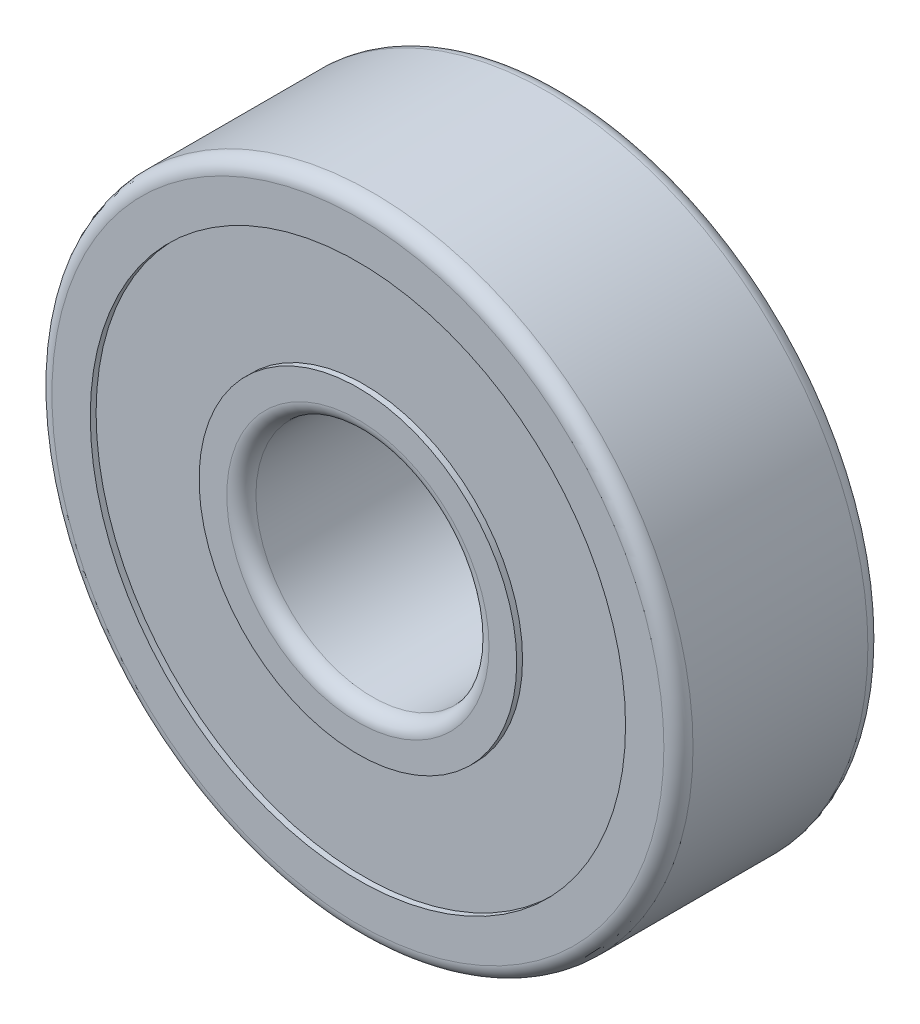
ISO-10303-21;
HEADER;
FILE_DESCRIPTION(('STEP AP214'),'2;1');
FILE_NAME('part.step','',(''),(''),'','','');
FILE_SCHEMA(('AUTOMOTIVE_DESIGN { 1 0 10303 214 1 1 1 1 }'));
ENDSEC;
DATA;
#1=APPLICATION_CONTEXT('core data for automotive mechanical design processes');
#2=APPLICATION_PROTOCOL_DEFINITION('international standard','automotive_design',2000,#1);
#3=PRODUCT_CONTEXT('',#1,'mechanical');
#4=PRODUCT('Part','Part','',(#3));
#5=PRODUCT_RELATED_PRODUCT_CATEGORY('part','',(#4));
#6=PRODUCT_DEFINITION_FORMATION('','',#4);
#7=PRODUCT_DEFINITION_CONTEXT('part definition',#1,'design');
#8=PRODUCT_DEFINITION('design','',#6,#7);
#9=PRODUCT_DEFINITION_SHAPE('','',#8);
#10=(LENGTH_UNIT() NAMED_UNIT(*) SI_UNIT(.MILLI.,.METRE.));
#11=(NAMED_UNIT(*) PLANE_ANGLE_UNIT() SI_UNIT($,.RADIAN.));
#12=(NAMED_UNIT(*) SI_UNIT($,.STERADIAN.) SOLID_ANGLE_UNIT());
#13=UNCERTAINTY_MEASURE_WITH_UNIT(LENGTH_MEASURE(1.E-05),#10,'distance_accuracy_value','');
#14=(GEOMETRIC_REPRESENTATION_CONTEXT(3) GLOBAL_UNCERTAINTY_ASSIGNED_CONTEXT((#13)) GLOBAL_UNIT_ASSIGNED_CONTEXT((#10,
#11,#12)) REPRESENTATION_CONTEXT('',''));
#15=CARTESIAN_POINT('',(0.,0.,0.));
#16=DIRECTION('',(0.,0.,1.));
#17=DIRECTION('',(1.,0.,0.));
#18=AXIS2_PLACEMENT_3D('',#15,#16,#17);
#19=CARTESIAN_POINT('',(0.,0.,-3.5));
#20=DIRECTION('',(0.,0.,1.));
#21=DIRECTION('',(1.,0.,0.));
#22=AXIS2_PLACEMENT_3D('',#19,#20,#21);
#23=PLANE('',#22);
#24=CARTESIAN_POINT('',(0.,0.,-3.5));
#25=DIRECTION('',(0.,0.,1.));
#26=DIRECTION('',(1.,0.,0.));
#27=AXIS2_PLACEMENT_3D('',#24,#25,#26);
#28=CIRCLE('',#27,10.5);
#29=CARTESIAN_POINT('',(10.5,0.,-3.5));
#30=VERTEX_POINT('',#29);
#31=EDGE_CURVE('E39',#30,#30,#28,.F.);
#32=ORIENTED_EDGE('',*,*,#31,.T.);
#33=EDGE_LOOP('',(#32));
#34=FACE_BOUND('',#33,.T.);
#35=CARTESIAN_POINT('',(0.,0.,-3.5));
#36=DIRECTION('',(0.,0.,1.));
#37=DIRECTION('',(1.,0.,0.));
#38=AXIS2_PLACEMENT_3D('',#35,#36,#37);
#39=CIRCLE('',#38,9.18472454375041);
#40=CARTESIAN_POINT('',(9.18472454375041,0.,-3.5));
#41=VERTEX_POINT('',#40);
#42=EDGE_CURVE('E77',#41,#41,#39,.T.);
#43=ORIENTED_EDGE('',*,*,#42,.T.);
#44=EDGE_LOOP('',(#43));
#45=FACE_BOUND('',#44,.T.);
#46=ADVANCED_FACE('F32',(#34,#45),#23,.F.);
#47=CARTESIAN_POINT('',(0.,0.,3.5));
#48=DIRECTION('',(0.,0.,1.));
#49=DIRECTION('',(1.,0.,0.));
#50=AXIS2_PLACEMENT_3D('',#47,#48,#49);
#51=PLANE('',#50);
#52=CARTESIAN_POINT('',(0.,0.,3.5));
#53=DIRECTION('',(0.,0.,1.));
#54=DIRECTION('',(1.,0.,0.));
#55=AXIS2_PLACEMENT_3D('',#52,#53,#54);
#56=CIRCLE('',#55,4.5);
#57=CARTESIAN_POINT('',(4.5,0.,3.5));
#58=VERTEX_POINT('',#57);
#59=EDGE_CURVE('E55',#58,#58,#56,.F.);
#60=ORIENTED_EDGE('',*,*,#59,.T.);
#61=EDGE_LOOP('',(#60));
#62=FACE_BOUND('',#61,.T.);
#63=CARTESIAN_POINT('',(0.,0.,3.5));
#64=DIRECTION('',(0.,0.,1.));
#65=DIRECTION('',(1.,0.,0.));
#66=AXIS2_PLACEMENT_3D('',#63,#64,#65);
#67=CIRCLE('',#66,5.45025485148313);
#68=CARTESIAN_POINT('',(5.45025485148313,0.,3.5));
#69=VERTEX_POINT('',#68);
#70=EDGE_CURVE('E71',#69,#69,#67,.T.);
#71=ORIENTED_EDGE('',*,*,#70,.T.);
#72=EDGE_LOOP('',(#71));
#73=FACE_BOUND('',#72,.T.);
#74=ADVANCED_FACE('F111',(#62,#73),#51,.T.);
#75=CARTESIAN_POINT('',(0.,0.,3.5));
#76=DIRECTION('',(0.,0.,1.));
#77=DIRECTION('',(1.,0.,0.));
#78=AXIS2_PLACEMENT_3D('',#75,#76,#77);
#79=CIRCLE('',#78,10.5);
#80=CARTESIAN_POINT('',(10.5,0.,3.5));
#81=VERTEX_POINT('',#80);
#82=EDGE_CURVE('E52',#81,#81,#79,.T.);
#83=ORIENTED_EDGE('',*,*,#82,.T.);
#84=EDGE_LOOP('',(#83));
#85=FACE_BOUND('',#84,.T.);
#86=CARTESIAN_POINT('',(0.,0.,3.5));
#87=DIRECTION('',(0.,0.,1.));
#88=DIRECTION('',(1.,0.,0.));
#89=AXIS2_PLACEMENT_3D('',#86,#87,#88);
#90=CIRCLE('',#89,9.18472454375041);
#91=CARTESIAN_POINT('',(9.18472454375041,0.,3.5));
#92=VERTEX_POINT('',#91);
#93=EDGE_CURVE('E65',#92,#92,#90,.T.);
#94=ORIENTED_EDGE('',*,*,#93,.F.);
#95=EDGE_LOOP('',(#94));
#96=FACE_BOUND('',#95,.T.);
#97=ADVANCED_FACE('F102',(#85,#96),#51,.T.);
#98=CARTESIAN_POINT('',(0.,0.,-3.5));
#99=DIRECTION('',(0.,0.,1.));
#100=DIRECTION('',(1.,0.,0.));
#101=AXIS2_PLACEMENT_3D('',#98,#99,#100);
#102=CIRCLE('',#101,4.5);
#103=CARTESIAN_POINT('',(4.5,0.,-3.5));
#104=VERTEX_POINT('',#103);
#105=EDGE_CURVE('E10',#104,#104,#102,.T.);
#106=ORIENTED_EDGE('',*,*,#105,.T.);
#107=EDGE_LOOP('',(#106));
#108=FACE_BOUND('',#107,.T.);
#109=CARTESIAN_POINT('',(0.,0.,-3.5));
#110=DIRECTION('',(0.,0.,1.));
#111=DIRECTION('',(1.,0.,0.));
#112=AXIS2_PLACEMENT_3D('',#109,#110,#111);
#113=CIRCLE('',#112,5.45025485148313);
#114=CARTESIAN_POINT('',(5.45025485148313,0.,-3.5));
#115=VERTEX_POINT('',#114);
#116=EDGE_CURVE('E83',#115,#115,#113,.T.);
#117=ORIENTED_EDGE('',*,*,#116,.F.);
#118=EDGE_LOOP('',(#117));
#119=FACE_BOUND('',#118,.T.);
#120=ADVANCED_FACE('F99',(#108,#119),#23,.F.);
#121=CARTESIAN_POINT('',(0.,0.,3.5));
#122=DIRECTION('',(0.,0.,-1.));
#123=DIRECTION('',(-1.,0.,0.));
#124=AXIS2_PLACEMENT_3D('',#121,#122,#123);
#125=CYLINDRICAL_SURFACE('',#124,11.);
#126=CARTESIAN_POINT('',(0.,0.,3.));
#127=DIRECTION('',(0.,0.,1.));
#128=DIRECTION('',(1.,0.,0.));
#129=AXIS2_PLACEMENT_3D('',#126,#127,#128);
#130=CIRCLE('',#129,11.);
#131=CARTESIAN_POINT('',(11.,0.,3.));
#132=VERTEX_POINT('',#131);
#133=EDGE_CURVE('E43',#132,#132,#130,.F.);
#134=ORIENTED_EDGE('',*,*,#133,.T.);
#135=EDGE_LOOP('',(#134));
#136=FACE_BOUND('',#135,.T.);
#137=CARTESIAN_POINT('',(0.,0.,-3.));
#138=DIRECTION('',(0.,0.,1.));
#139=DIRECTION('',(1.,0.,0.));
#140=AXIS2_PLACEMENT_3D('',#137,#138,#139);
#141=CIRCLE('',#140,11.);
#142=CARTESIAN_POINT('',(11.,0.,-3.));
#143=VERTEX_POINT('',#142);
#144=EDGE_CURVE('E47',#143,#143,#141,.T.);
#145=ORIENTED_EDGE('',*,*,#144,.T.);
#146=EDGE_LOOP('',(#145));
#147=FACE_BOUND('',#146,.T.);
#148=ADVANCED_FACE('F101',(#136,#147),#125,.T.);
#149=CARTESIAN_POINT('',(0.,0.,3.5));
#150=DIRECTION('',(0.,0.,-1.));
#151=DIRECTION('',(-1.,0.,0.));
#152=AXIS2_PLACEMENT_3D('',#149,#150,#151);
#153=CYLINDRICAL_SURFACE('',#152,4.);
#154=CARTESIAN_POINT('',(0.,0.,3.));
#155=DIRECTION('',(0.,0.,1.));
#156=DIRECTION('',(1.,0.,0.));
#157=AXIS2_PLACEMENT_3D('',#154,#155,#156);
#158=CIRCLE('',#157,4.);
#159=CARTESIAN_POINT('',(4.,0.,3.));
#160=VERTEX_POINT('',#159);
#161=EDGE_CURVE('E58',#160,#160,#158,.T.);
#162=ORIENTED_EDGE('',*,*,#161,.T.);
#163=EDGE_LOOP('',(#162));
#164=FACE_BOUND('',#163,.T.);
#165=CARTESIAN_POINT('',(0.,0.,-3.));
#166=DIRECTION('',(0.,0.,1.));
#167=DIRECTION('',(1.,0.,0.));
#168=AXIS2_PLACEMENT_3D('',#165,#166,#167);
#169=CIRCLE('',#168,4.);
#170=CARTESIAN_POINT('',(4.,0.,-3.));
#171=VERTEX_POINT('',#170);
#172=EDGE_CURVE('E61',#171,#171,#169,.F.);
#173=ORIENTED_EDGE('',*,*,#172,.T.);
#174=EDGE_LOOP('',(#173));
#175=FACE_BOUND('',#174,.T.);
#176=ADVANCED_FACE('F108',(#164,#175),#153,.F.);
#177=CARTESIAN_POINT('',(0.,0.,3.3));
#178=DIRECTION('',(0.,0.,1.));
#179=DIRECTION('',(1.,0.,0.));
#180=AXIS2_PLACEMENT_3D('',#177,#178,#179);
#181=CYLINDRICAL_SURFACE('',#180,9.18472454375041);
#182=CARTESIAN_POINT('',(0.,0.,3.3));
#183=DIRECTION('',(0.,0.,1.));
#184=DIRECTION('',(1.,0.,0.));
#185=AXIS2_PLACEMENT_3D('',#182,#183,#184);
#186=CIRCLE('',#185,9.18472454375041);
#187=CARTESIAN_POINT('',(9.18472454375041,0.,3.3));
#188=VERTEX_POINT('',#187);
#189=EDGE_CURVE('E64',#188,#188,#186,.T.);
#190=ORIENTED_EDGE('',*,*,#189,.F.);
#191=EDGE_LOOP('',(#190));
#192=FACE_BOUND('',#191,.T.);
#193=ORIENTED_EDGE('',*,*,#93,.T.);
#194=EDGE_LOOP('',(#193));
#195=FACE_BOUND('',#194,.T.);
#196=ADVANCED_FACE('F138',(#192,#195),#181,.F.);
#197=CARTESIAN_POINT('',(0.,0.,3.3));
#198=DIRECTION('',(0.,0.,1.));
#199=DIRECTION('',(1.,0.,0.));
#200=AXIS2_PLACEMENT_3D('',#197,#198,#199);
#201=PLANE('',#200);
#202=CARTESIAN_POINT('',(0.,0.,3.3));
#203=DIRECTION('',(0.,0.,1.));
#204=DIRECTION('',(1.,0.,0.));
#205=AXIS2_PLACEMENT_3D('',#202,#203,#204);
#206=CIRCLE('',#205,5.45025485148313);
#207=CARTESIAN_POINT('',(5.45025485148313,0.,3.3));
#208=VERTEX_POINT('',#207);
#209=EDGE_CURVE('E68',#208,#208,#206,.T.);
#210=ORIENTED_EDGE('',*,*,#209,.F.);
#211=EDGE_LOOP('',(#210));
#212=FACE_BOUND('',#211,.T.);
#213=ORIENTED_EDGE('',*,*,#189,.T.);
#214=EDGE_LOOP('',(#213));
#215=FACE_BOUND('',#214,.T.);
#216=ADVANCED_FACE('F134',(#212,#215),#201,.T.);
#217=CARTESIAN_POINT('',(0.,0.,3.3));
#218=DIRECTION('',(0.,0.,1.));
#219=DIRECTION('',(1.,0.,0.));
#220=AXIS2_PLACEMENT_3D('',#217,#218,#219);
#221=CYLINDRICAL_SURFACE('',#220,5.45025485148313);
#222=ORIENTED_EDGE('',*,*,#209,.T.);
#223=EDGE_LOOP('',(#222));
#224=FACE_BOUND('',#223,.T.);
#225=ORIENTED_EDGE('',*,*,#70,.F.);
#226=EDGE_LOOP('',(#225));
#227=FACE_BOUND('',#226,.T.);
#228=ADVANCED_FACE('F128',(#224,#227),#221,.T.);
#229=CARTESIAN_POINT('',(0.,0.,-3.3));
#230=DIRECTION('',(0.,0.,-1.));
#231=DIRECTION('',(1.,0.,0.));
#232=AXIS2_PLACEMENT_3D('',#229,#230,#231);
#233=PLANE('',#232);
#234=CARTESIAN_POINT('',(0.,0.,-3.3));
#235=DIRECTION('',(0.,0.,1.));
#236=DIRECTION('',(1.,0.,0.));
#237=AXIS2_PLACEMENT_3D('',#234,#235,#236);
#238=CIRCLE('',#237,9.18472454375041);
#239=CARTESIAN_POINT('',(9.18472454375041,0.,-3.3));
#240=VERTEX_POINT('',#239);
#241=EDGE_CURVE('E74',#240,#240,#238,.T.);
#242=ORIENTED_EDGE('',*,*,#241,.F.);
#243=EDGE_LOOP('',(#242));
#244=FACE_BOUND('',#243,.T.);
#245=CARTESIAN_POINT('',(0.,0.,-3.3));
#246=DIRECTION('',(0.,0.,1.));
#247=DIRECTION('',(1.,0.,0.));
#248=AXIS2_PLACEMENT_3D('',#245,#246,#247);
#249=CIRCLE('',#248,5.45025485148313);
#250=CARTESIAN_POINT('',(5.45025485148313,0.,-3.3));
#251=VERTEX_POINT('',#250);
#252=EDGE_CURVE('E80',#251,#251,#249,.T.);
#253=ORIENTED_EDGE('',*,*,#252,.T.);
#254=EDGE_LOOP('',(#253));
#255=FACE_BOUND('',#254,.T.);
#256=ADVANCED_FACE('F89',(#244,#255),#233,.T.);
#257=CARTESIAN_POINT('',(0.,0.,-3.3));
#258=DIRECTION('',(0.,0.,-1.));
#259=DIRECTION('',(-1.,0.,0.));
#260=AXIS2_PLACEMENT_3D('',#257,#258,#259);
#261=CYLINDRICAL_SURFACE('',#260,9.18472454375041);
#262=ORIENTED_EDGE('',*,*,#241,.T.);
#263=EDGE_LOOP('',(#262));
#264=FACE_BOUND('',#263,.T.);
#265=ORIENTED_EDGE('',*,*,#42,.F.);
#266=EDGE_LOOP('',(#265));
#267=FACE_BOUND('',#266,.T.);
#268=ADVANCED_FACE('F95',(#264,#267),#261,.F.);
#269=CARTESIAN_POINT('',(0.,0.,-3.3));
#270=DIRECTION('',(0.,0.,-1.));
#271=DIRECTION('',(-1.,0.,0.));
#272=AXIS2_PLACEMENT_3D('',#269,#270,#271);
#273=CYLINDRICAL_SURFACE('',#272,5.45025485148313);
#274=ORIENTED_EDGE('',*,*,#252,.F.);
#275=EDGE_LOOP('',(#274));
#276=FACE_BOUND('',#275,.T.);
#277=ORIENTED_EDGE('',*,*,#116,.T.);
#278=EDGE_LOOP('',(#277));
#279=FACE_BOUND('',#278,.T.);
#280=ADVANCED_FACE('F91',(#276,#279),#273,.T.);
#281=CARTESIAN_POINT('',(0.,0.,3.));
#282=DIRECTION('',(0.,0.,1.));
#283=DIRECTION('',(1.,0.,0.));
#284=AXIS2_PLACEMENT_3D('',#281,#282,#283);
#285=TOROIDAL_SURFACE('',#284,4.5,0.5);
#286=ORIENTED_EDGE('',*,*,#59,.F.);
#287=EDGE_LOOP('',(#286));
#288=FACE_BOUND('',#287,.T.);
#289=ORIENTED_EDGE('',*,*,#161,.F.);
#290=EDGE_LOOP('',(#289));
#291=FACE_BOUND('',#290,.T.);
#292=ADVANCED_FACE('F94',(#288,#291),#285,.T.);
#293=CARTESIAN_POINT('',(0.,0.,3.));
#294=DIRECTION('',(0.,0.,1.));
#295=DIRECTION('',(1.,0.,0.));
#296=AXIS2_PLACEMENT_3D('',#293,#294,#295);
#297=TOROIDAL_SURFACE('',#296,10.5,0.5);
#298=ORIENTED_EDGE('',*,*,#133,.F.);
#299=EDGE_LOOP('',(#298));
#300=FACE_BOUND('',#299,.T.);
#301=ORIENTED_EDGE('',*,*,#82,.F.);
#302=EDGE_LOOP('',(#301));
#303=FACE_BOUND('',#302,.T.);
#304=ADVANCED_FACE('F157',(#300,#303),#297,.T.);
#305=CARTESIAN_POINT('',(0.,0.,-3.));
#306=DIRECTION('',(0.,0.,1.));
#307=DIRECTION('',(1.,0.,0.));
#308=AXIS2_PLACEMENT_3D('',#305,#306,#307);
#309=TOROIDAL_SURFACE('',#308,10.5,0.5);
#310=ORIENTED_EDGE('',*,*,#31,.F.);
#311=EDGE_LOOP('',(#310));
#312=FACE_BOUND('',#311,.T.);
#313=ORIENTED_EDGE('',*,*,#144,.F.);
#314=EDGE_LOOP('',(#313));
#315=FACE_BOUND('',#314,.T.);
#316=ADVANCED_FACE('F153',(#312,#315),#309,.T.);
#317=CARTESIAN_POINT('',(0.,0.,-3.));
#318=DIRECTION('',(0.,0.,1.));
#319=DIRECTION('',(1.,0.,0.));
#320=AXIS2_PLACEMENT_3D('',#317,#318,#319);
#321=TOROIDAL_SURFACE('',#320,4.5,0.5);
#322=ORIENTED_EDGE('',*,*,#172,.F.);
#323=EDGE_LOOP('',(#322));
#324=FACE_BOUND('',#323,.T.);
#325=ORIENTED_EDGE('',*,*,#105,.F.);
#326=EDGE_LOOP('',(#325));
#327=FACE_BOUND('',#326,.T.);
#328=ADVANCED_FACE('F34',(#324,#327),#321,.T.);
#329=CLOSED_SHELL('',(#46,#74,#97,#120,#148,#176,#196,#216,#228,#256,#268,#280,#292,#304,#316,#328));
#330=MANIFOLD_SOLID_BREP('B2',#329);
#331=ADVANCED_BREP_SHAPE_REPRESENTATION('',(#18,#330),#14);
#332=SHAPE_DEFINITION_REPRESENTATION(#9,#331);
ENDSEC;
END-ISO-10303-21;
